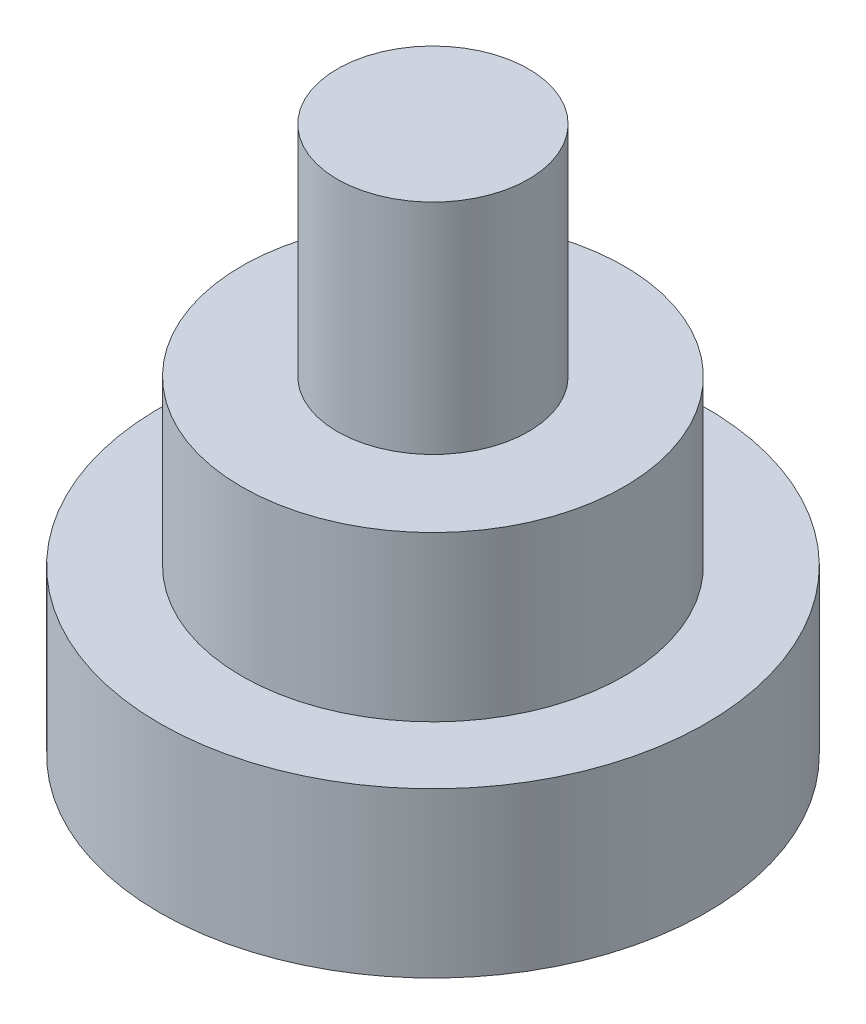
ISO-10303-21;
HEADER;
FILE_DESCRIPTION(('STEP AP214'),'2;1');
FILE_NAME('part.step','',(''),(''),'','','');
FILE_SCHEMA(('AUTOMOTIVE_DESIGN { 1 0 10303 214 1 1 1 1 }'));
ENDSEC;
DATA;
#1=APPLICATION_CONTEXT('core data for automotive mechanical design processes');
#2=APPLICATION_PROTOCOL_DEFINITION('international standard','automotive_design',2000,#1);
#3=PRODUCT_CONTEXT('',#1,'mechanical');
#4=PRODUCT('Part','Part','',(#3));
#5=PRODUCT_RELATED_PRODUCT_CATEGORY('part','',(#4));
#6=PRODUCT_DEFINITION_FORMATION('','',#4);
#7=PRODUCT_DEFINITION_CONTEXT('part definition',#1,'design');
#8=PRODUCT_DEFINITION('design','',#6,#7);
#9=PRODUCT_DEFINITION_SHAPE('','',#8);
#10=(LENGTH_UNIT() NAMED_UNIT(*) SI_UNIT(.MILLI.,.METRE.));
#11=(NAMED_UNIT(*) PLANE_ANGLE_UNIT() SI_UNIT($,.RADIAN.));
#12=(NAMED_UNIT(*) SI_UNIT($,.STERADIAN.) SOLID_ANGLE_UNIT());
#13=UNCERTAINTY_MEASURE_WITH_UNIT(LENGTH_MEASURE(1.E-05),#10,'distance_accuracy_value','');
#14=(GEOMETRIC_REPRESENTATION_CONTEXT(3) GLOBAL_UNCERTAINTY_ASSIGNED_CONTEXT((#13)) GLOBAL_UNIT_ASSIGNED_CONTEXT((#10,
#11,#12)) REPRESENTATION_CONTEXT('',''));
#15=CARTESIAN_POINT('',(0.,0.,0.));
#16=DIRECTION('',(0.,0.,1.));
#17=DIRECTION('',(1.,0.,0.));
#18=AXIS2_PLACEMENT_3D('',#15,#16,#17);
#19=CARTESIAN_POINT('',(0.,3.,0.));
#20=DIRECTION('',(0.,-1.,0.));
#21=DIRECTION('',(0.,0.,-1.));
#22=AXIS2_PLACEMENT_3D('',#19,#20,#21);
#23=CYLINDRICAL_SURFACE('',#22,5.);
#24=CARTESIAN_POINT('',(0.,3.,0.));
#25=DIRECTION('',(0.,1.,0.));
#26=DIRECTION('',(0.,0.,1.));
#27=AXIS2_PLACEMENT_3D('',#24,#25,#26);
#28=CIRCLE('',#27,5.);
#29=CARTESIAN_POINT('',(0.,3.,5.));
#30=VERTEX_POINT('',#29);
#31=EDGE_CURVE('E57',#30,#30,#28,.T.);
#32=ORIENTED_EDGE('',*,*,#31,.F.);
#33=EDGE_LOOP('',(#32));
#34=FACE_BOUND('',#33,.T.);
#35=CARTESIAN_POINT('',(0.,0.,0.));
#36=DIRECTION('',(0.,1.,0.));
#37=DIRECTION('',(0.,0.,1.));
#38=AXIS2_PLACEMENT_3D('',#35,#36,#37);
#39=CIRCLE('',#38,5.);
#40=CARTESIAN_POINT('',(0.,0.,5.));
#41=VERTEX_POINT('',#40);
#42=EDGE_CURVE('E46',#41,#41,#39,.T.);
#43=ORIENTED_EDGE('',*,*,#42,.T.);
#44=EDGE_LOOP('',(#43));
#45=FACE_BOUND('',#44,.T.);
#46=ADVANCED_FACE('F43',(#34,#45),#23,.T.);
#47=CARTESIAN_POINT('',(0.,3.,0.));
#48=DIRECTION('',(0.,1.,0.));
#49=DIRECTION('',(0.,0.,1.));
#50=AXIS2_PLACEMENT_3D('',#47,#48,#49);
#51=PLANE('',#50);
#52=CARTESIAN_POINT('',(0.,3.,0.));
#53=DIRECTION('',(0.,1.,0.));
#54=DIRECTION('',(0.,0.,1.));
#55=AXIS2_PLACEMENT_3D('',#52,#53,#54);
#56=CIRCLE('',#55,3.5);
#57=CARTESIAN_POINT('',(0.,3.,3.5));
#58=VERTEX_POINT('',#57);
#59=EDGE_CURVE('E51',#58,#58,#56,.T.);
#60=ORIENTED_EDGE('',*,*,#59,.F.);
#61=EDGE_LOOP('',(#60));
#62=FACE_BOUND('',#61,.T.);
#63=ORIENTED_EDGE('',*,*,#31,.T.);
#64=EDGE_LOOP('',(#63));
#65=FACE_BOUND('',#64,.T.);
#66=ADVANCED_FACE('F78',(#62,#65),#51,.T.);
#67=CARTESIAN_POINT('',(0.,0.,0.));
#68=DIRECTION('',(0.,1.,0.));
#69=DIRECTION('',(0.,0.,1.));
#70=AXIS2_PLACEMENT_3D('',#67,#68,#69);
#71=PLANE('',#70);
#72=CARTESIAN_POINT('',(0.,0.,0.));
#73=DIRECTION('',(0.,-1.,0.));
#74=DIRECTION('',(0.,0.,-1.));
#75=AXIS2_PLACEMENT_3D('',#72,#73,#74);
#76=CIRCLE('',#75,4.);
#77=CARTESIAN_POINT('',(0.,0.,-4.));
#78=VERTEX_POINT('',#77);
#79=EDGE_CURVE('E158',#78,#78,#76,.T.);
#80=ORIENTED_EDGE('',*,*,#79,.F.);
#81=EDGE_LOOP('',(#80));
#82=FACE_BOUND('',#81,.T.);
#83=ORIENTED_EDGE('',*,*,#42,.F.);
#84=EDGE_LOOP('',(#83));
#85=FACE_BOUND('',#84,.T.);
#86=ADVANCED_FACE('F75',(#82,#85),#71,.F.);
#87=CARTESIAN_POINT('',(0.,6.,0.));
#88=DIRECTION('',(0.,-1.,0.));
#89=DIRECTION('',(0.,0.,-1.));
#90=AXIS2_PLACEMENT_3D('',#87,#88,#89);
#91=CYLINDRICAL_SURFACE('',#90,3.5);
#92=CARTESIAN_POINT('',(0.,6.,0.));
#93=DIRECTION('',(0.,1.,0.));
#94=DIRECTION('',(0.,0.,1.));
#95=AXIS2_PLACEMENT_3D('',#92,#93,#94);
#96=CIRCLE('',#95,3.5);
#97=CARTESIAN_POINT('',(0.,6.,3.5));
#98=VERTEX_POINT('',#97);
#99=EDGE_CURVE('E63',#98,#98,#96,.T.);
#100=ORIENTED_EDGE('',*,*,#99,.F.);
#101=EDGE_LOOP('',(#100));
#102=FACE_BOUND('',#101,.T.);
#103=ORIENTED_EDGE('',*,*,#59,.T.);
#104=EDGE_LOOP('',(#103));
#105=FACE_BOUND('',#104,.T.);
#106=ADVANCED_FACE('F77',(#102,#105),#91,.T.);
#107=CARTESIAN_POINT('',(0.,6.,0.));
#108=DIRECTION('',(0.,1.,0.));
#109=DIRECTION('',(0.,0.,1.));
#110=AXIS2_PLACEMENT_3D('',#107,#108,#109);
#111=PLANE('',#110);
#112=CARTESIAN_POINT('',(0.,6.,0.));
#113=DIRECTION('',(0.,1.,0.));
#114=DIRECTION('',(0.,0.,1.));
#115=AXIS2_PLACEMENT_3D('',#112,#113,#114);
#116=CIRCLE('',#115,1.75);
#117=CARTESIAN_POINT('',(0.,6.,1.75));
#118=VERTEX_POINT('',#117);
#119=EDGE_CURVE('E10',#118,#118,#116,.T.);
#120=ORIENTED_EDGE('',*,*,#119,.F.);
#121=EDGE_LOOP('',(#120));
#122=FACE_BOUND('',#121,.T.);
#123=ORIENTED_EDGE('',*,*,#99,.T.);
#124=EDGE_LOOP('',(#123));
#125=FACE_BOUND('',#124,.T.);
#126=ADVANCED_FACE('F85',(#122,#125),#111,.T.);
#127=CARTESIAN_POINT('',(0.,10.,0.));
#128=DIRECTION('',(0.,-1.,0.));
#129=DIRECTION('',(0.,0.,-1.));
#130=AXIS2_PLACEMENT_3D('',#127,#128,#129);
#131=CYLINDRICAL_SURFACE('',#130,1.75);
#132=CARTESIAN_POINT('',(0.,10.,0.));
#133=DIRECTION('',(0.,1.,0.));
#134=DIRECTION('',(0.,0.,1.));
#135=AXIS2_PLACEMENT_3D('',#132,#133,#134);
#136=CIRCLE('',#135,1.75);
#137=CARTESIAN_POINT('',(0.,10.,1.75));
#138=VERTEX_POINT('',#137);
#139=EDGE_CURVE('E61',#138,#138,#136,.T.);
#140=ORIENTED_EDGE('',*,*,#139,.F.);
#141=EDGE_LOOP('',(#140));
#142=FACE_BOUND('',#141,.T.);
#143=ORIENTED_EDGE('',*,*,#119,.T.);
#144=EDGE_LOOP('',(#143));
#145=FACE_BOUND('',#144,.T.);
#146=ADVANCED_FACE('F113',(#142,#145),#131,.T.);
#147=CARTESIAN_POINT('',(0.,10.,0.));
#148=DIRECTION('',(0.,1.,0.));
#149=DIRECTION('',(0.,0.,1.));
#150=AXIS2_PLACEMENT_3D('',#147,#148,#149);
#151=PLANE('',#150);
#152=ORIENTED_EDGE('',*,*,#139,.T.);
#153=EDGE_LOOP('',(#152));
#154=FACE_BOUND('',#153,.T.);
#155=ADVANCED_FACE('F121',(#154),#151,.T.);
#156=CARTESIAN_POINT('',(0.,1.5,0.));
#157=DIRECTION('',(0.,-1.,0.));
#158=DIRECTION('',(0.,0.,-1.));
#159=AXIS2_PLACEMENT_3D('',#156,#157,#158);
#160=CYLINDRICAL_SURFACE('',#159,4.);
#161=CARTESIAN_POINT('',(0.,1.5,0.));
#162=DIRECTION('',(0.,-1.,0.));
#163=DIRECTION('',(0.,0.,-1.));
#164=AXIS2_PLACEMENT_3D('',#161,#162,#163);
#165=CIRCLE('',#164,4.);
#166=CARTESIAN_POINT('',(0.,1.5,-4.));
#167=VERTEX_POINT('',#166);
#168=EDGE_CURVE('E156',#167,#167,#165,.T.);
#169=ORIENTED_EDGE('',*,*,#168,.F.);
#170=EDGE_LOOP('',(#169));
#171=FACE_BOUND('',#170,.T.);
#172=ORIENTED_EDGE('',*,*,#79,.T.);
#173=EDGE_LOOP('',(#172));
#174=FACE_BOUND('',#173,.T.);
#175=ADVANCED_FACE('F129',(#171,#174),#160,.F.);
#176=CARTESIAN_POINT('',(0.,1.5,0.));
#177=DIRECTION('',(0.,-1.,0.));
#178=DIRECTION('',(0.,0.,-1.));
#179=AXIS2_PLACEMENT_3D('',#176,#177,#178);
#180=PLANE('',#179);
#181=ORIENTED_EDGE('',*,*,#168,.T.);
#182=EDGE_LOOP('',(#181));
#183=FACE_BOUND('',#182,.T.);
#184=ADVANCED_FACE('F141',(#183),#180,.T.);
#185=CLOSED_SHELL('',(#46,#66,#86,#106,#126,#146,#155,#175,#184));
#186=MANIFOLD_SOLID_BREP('B2',#185);
#187=ADVANCED_BREP_SHAPE_REPRESENTATION('',(#18,#186),#14);
#188=SHAPE_DEFINITION_REPRESENTATION(#9,#187);
ENDSEC;
END-ISO-10303-21;
